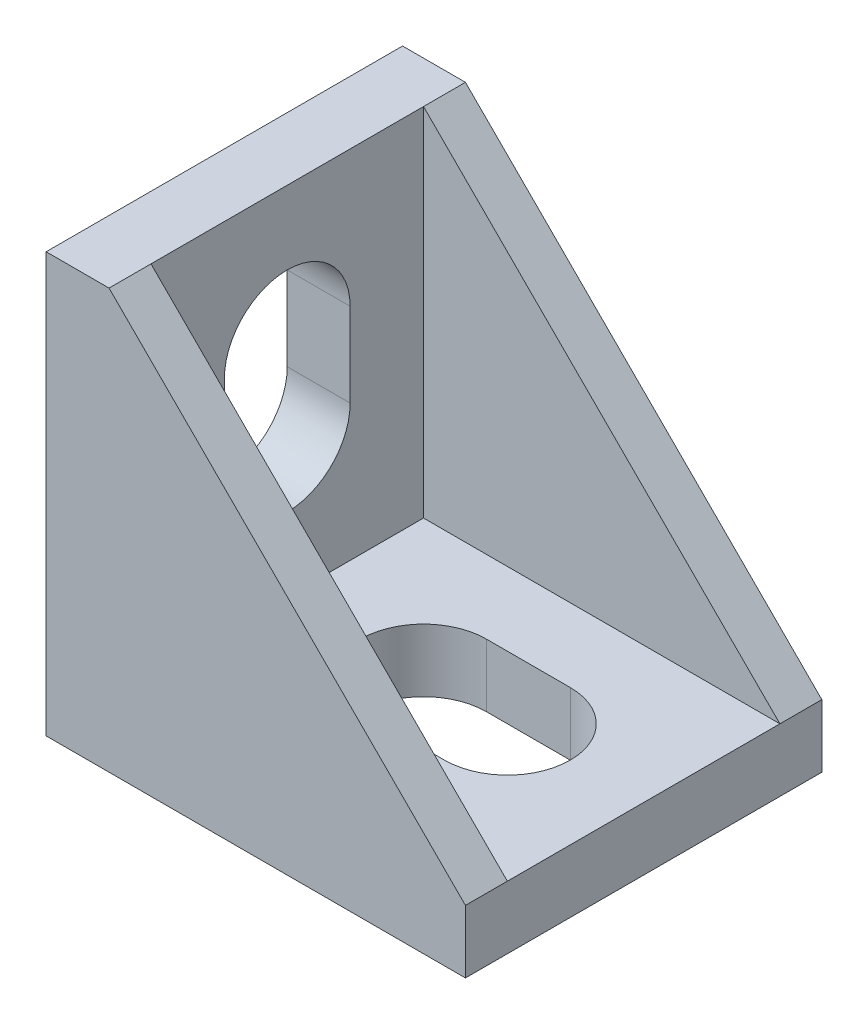
ISO-10303-21;
HEADER;
FILE_DESCRIPTION(('STEP AP214'),'2;1');
FILE_NAME('part.step','',(''),(''),'','','');
FILE_SCHEMA(('AUTOMOTIVE_DESIGN { 1 0 10303 214 1 1 1 1 }'));
ENDSEC;
DATA;
#1=APPLICATION_CONTEXT('core data for automotive mechanical design processes');
#2=APPLICATION_PROTOCOL_DEFINITION('international standard','automotive_design',2000,#1);
#3=PRODUCT_CONTEXT('',#1,'mechanical');
#4=PRODUCT('Part','Part','',(#3));
#5=PRODUCT_RELATED_PRODUCT_CATEGORY('part','',(#4));
#6=PRODUCT_DEFINITION_FORMATION('','',#4);
#7=PRODUCT_DEFINITION_CONTEXT('part definition',#1,'design');
#8=PRODUCT_DEFINITION('design','',#6,#7);
#9=PRODUCT_DEFINITION_SHAPE('','',#8);
#10=(LENGTH_UNIT() NAMED_UNIT(*) SI_UNIT(.MILLI.,.METRE.));
#11=(NAMED_UNIT(*) PLANE_ANGLE_UNIT() SI_UNIT($,.RADIAN.));
#12=(NAMED_UNIT(*) SI_UNIT($,.STERADIAN.) SOLID_ANGLE_UNIT());
#13=UNCERTAINTY_MEASURE_WITH_UNIT(LENGTH_MEASURE(1.E-05),#10,'distance_accuracy_value','');
#14=(GEOMETRIC_REPRESENTATION_CONTEXT(3) GLOBAL_UNCERTAINTY_ASSIGNED_CONTEXT((#13)) GLOBAL_UNIT_ASSIGNED_CONTEXT((#10,
#11,#12)) REPRESENTATION_CONTEXT('',''));
#15=CARTESIAN_POINT('',(0.,0.,0.));
#16=DIRECTION('',(0.,0.,1.));
#17=DIRECTION('',(1.,0.,0.));
#18=AXIS2_PLACEMENT_3D('',#15,#16,#17);
#19=CARTESIAN_POINT('',(0.,0.,17.));
#20=DIRECTION('',(1.,0.,0.));
#21=DIRECTION('',(0.,0.,-1.));
#22=AXIS2_PLACEMENT_3D('',#19,#20,#21);
#23=PLANE('',#22);
#24=DIRECTION('',(0.,-1.,0.));
#25=VECTOR('',#24,1.);
#26=CARTESIAN_POINT('',(0.,0.,0.));
#27=LINE('',#26,#25);
#28=CARTESIAN_POINT('',(0.,20.,0.));
#29=VERTEX_POINT('',#28);
#30=CARTESIAN_POINT('',(0.,0.,0.));
#31=VERTEX_POINT('',#30);
#32=EDGE_CURVE('E393',#29,#31,#27,.T.);
#33=ORIENTED_EDGE('',*,*,#32,.T.);
#34=DIRECTION('',(0.,0.,-1.));
#35=VECTOR('',#34,1.);
#36=CARTESIAN_POINT('',(0.,0.,17.));
#37=LINE('',#36,#35);
#38=CARTESIAN_POINT('',(0.,0.,17.));
#39=VERTEX_POINT('',#38);
#40=EDGE_CURVE('E400',#39,#31,#37,.T.);
#41=ORIENTED_EDGE('',*,*,#40,.F.);
#42=DIRECTION('',(0.,-1.,0.));
#43=VECTOR('',#42,1.);
#44=CARTESIAN_POINT('',(0.,0.,17.));
#45=LINE('',#44,#43);
#46=CARTESIAN_POINT('',(0.,20.,17.));
#47=VERTEX_POINT('',#46);
#48=EDGE_CURVE('E398',#47,#39,#45,.T.);
#49=ORIENTED_EDGE('',*,*,#48,.F.);
#50=DIRECTION('',(0.,0.,-1.));
#51=VECTOR('',#50,1.);
#52=CARTESIAN_POINT('',(0.,20.,17.));
#53=LINE('',#52,#51);
#54=EDGE_CURVE('E410',#47,#29,#53,.T.);
#55=ORIENTED_EDGE('',*,*,#54,.T.);
#56=EDGE_LOOP('',(#33,#41,#49,#55));
#57=FACE_BOUND('',#56,.T.);
#58=DIRECTION('',(0.,-1.,0.));
#59=VECTOR('',#58,1.);
#60=CARTESIAN_POINT('',(0.,13.5,5.50000000000001));
#61=LINE('',#60,#59);
#62=CARTESIAN_POINT('',(0.,13.5,5.50000000000001));
#63=VERTEX_POINT('',#62);
#64=CARTESIAN_POINT('',(0.,9.49999999999999,5.50000000000001));
#65=VERTEX_POINT('',#64);
#66=EDGE_CURVE('E308',#63,#65,#61,.T.);
#67=ORIENTED_EDGE('',*,*,#66,.F.);
#68=CARTESIAN_POINT('',(0.,13.5,8.5));
#69=DIRECTION('',(1.,0.,0.));
#70=DIRECTION('',(0.,0.,-1.));
#71=AXIS2_PLACEMENT_3D('',#68,#69,#70);
#72=CIRCLE('',#71,2.99999999999999);
#73=CARTESIAN_POINT('',(0.,13.5,11.5));
#74=VERTEX_POINT('',#73);
#75=EDGE_CURVE('E312',#63,#74,#72,.T.);
#76=ORIENTED_EDGE('',*,*,#75,.T.);
#77=DIRECTION('',(0.,-1.,0.));
#78=VECTOR('',#77,1.);
#79=CARTESIAN_POINT('',(0.,13.5,11.5));
#80=LINE('',#79,#78);
#81=CARTESIAN_POINT('',(0.,9.49999999999999,11.5));
#82=VERTEX_POINT('',#81);
#83=EDGE_CURVE('E640',#74,#82,#80,.T.);
#84=ORIENTED_EDGE('',*,*,#83,.T.);
#85=CARTESIAN_POINT('',(0.,9.49999999999999,8.5));
#86=DIRECTION('',(1.,0.,0.));
#87=DIRECTION('',(0.,0.,-1.));
#88=AXIS2_PLACEMENT_3D('',#85,#86,#87);
#89=CIRCLE('',#88,2.99999999999999);
#90=EDGE_CURVE('E207',#82,#65,#89,.T.);
#91=ORIENTED_EDGE('',*,*,#90,.T.);
#92=EDGE_LOOP('',(#67,#76,#84,#91));
#93=FACE_BOUND('',#92,.T.);
#94=ADVANCED_FACE('F184',(#57,#93),#23,.F.);
#95=CARTESIAN_POINT('',(3.,3.,17.));
#96=DIRECTION('',(0.,-1.,0.));
#97=DIRECTION('',(0.,0.,-1.));
#98=AXIS2_PLACEMENT_3D('',#95,#96,#97);
#99=PLANE('',#98);
#100=CARTESIAN_POINT('',(9.50000000000001,3.,8.5));
#101=DIRECTION('',(0.,1.,0.));
#102=DIRECTION('',(0.,0.,1.));
#103=AXIS2_PLACEMENT_3D('',#100,#101,#102);
#104=CIRCLE('',#103,3.);
#105=CARTESIAN_POINT('',(9.5,3.,5.5));
#106=VERTEX_POINT('',#105);
#107=CARTESIAN_POINT('',(9.5,3.,11.5));
#108=VERTEX_POINT('',#107);
#109=EDGE_CURVE('E341',#106,#108,#104,.T.);
#110=ORIENTED_EDGE('',*,*,#109,.F.);
#111=DIRECTION('',(1.,0.,0.));
#112=VECTOR('',#111,1.);
#113=CARTESIAN_POINT('',(9.5,3.,5.5));
#114=LINE('',#113,#112);
#115=CARTESIAN_POINT('',(13.5,3.,5.5));
#116=VERTEX_POINT('',#115);
#117=EDGE_CURVE('E338',#106,#116,#114,.T.);
#118=ORIENTED_EDGE('',*,*,#117,.T.);
#119=CARTESIAN_POINT('',(13.5,3.,8.5));
#120=DIRECTION('',(0.,1.,0.));
#121=DIRECTION('',(0.,0.,1.));
#122=AXIS2_PLACEMENT_3D('',#119,#120,#121);
#123=CIRCLE('',#122,3.);
#124=CARTESIAN_POINT('',(13.5,3.,11.5));
#125=VERTEX_POINT('',#124);
#126=EDGE_CURVE('E351',#125,#116,#123,.T.);
#127=ORIENTED_EDGE('',*,*,#126,.F.);
#128=DIRECTION('',(1.,0.,0.));
#129=VECTOR('',#128,1.);
#130=CARTESIAN_POINT('',(9.5,3.,11.5));
#131=LINE('',#130,#129);
#132=EDGE_CURVE('E331',#108,#125,#131,.T.);
#133=ORIENTED_EDGE('',*,*,#132,.F.);
#134=EDGE_LOOP('',(#110,#118,#127,#133));
#135=FACE_BOUND('',#134,.T.);
#136=DIRECTION('',(0.,0.,-1.));
#137=VECTOR('',#136,1.);
#138=CARTESIAN_POINT('',(20.,3.,17.));
#139=LINE('',#138,#137);
#140=CARTESIAN_POINT('',(20.,3.,15.));
#141=VERTEX_POINT('',#140);
#142=CARTESIAN_POINT('',(20.,3.,2.));
#143=VERTEX_POINT('',#142);
#144=EDGE_CURVE('E419',#141,#143,#139,.T.);
#145=ORIENTED_EDGE('',*,*,#144,.T.);
#146=DIRECTION('',(-1.,0.,0.));
#147=VECTOR('',#146,1.);
#148=CARTESIAN_POINT('',(20.,3.,2.));
#149=LINE('',#148,#147);
#150=CARTESIAN_POINT('',(3.,3.,2.));
#151=VERTEX_POINT('',#150);
#152=EDGE_CURVE('E367',#143,#151,#149,.T.);
#153=ORIENTED_EDGE('',*,*,#152,.T.);
#154=DIRECTION('',(0.,0.,-1.));
#155=VECTOR('',#154,1.);
#156=CARTESIAN_POINT('',(3.,3.,17.));
#157=LINE('',#156,#155);
#158=CARTESIAN_POINT('',(3.,3.,15.));
#159=VERTEX_POINT('',#158);
#160=EDGE_CURVE('E417',#159,#151,#157,.T.);
#161=ORIENTED_EDGE('',*,*,#160,.F.);
#162=DIRECTION('',(1.,0.,0.));
#163=VECTOR('',#162,1.);
#164=CARTESIAN_POINT('',(20.,3.,15.));
#165=LINE('',#164,#163);
#166=EDGE_CURVE('E380',#159,#141,#165,.T.);
#167=ORIENTED_EDGE('',*,*,#166,.T.);
#168=EDGE_LOOP('',(#145,#153,#161,#167));
#169=FACE_BOUND('',#168,.T.);
#170=ADVANCED_FACE('F426',(#135,#169),#99,.F.);
#171=CARTESIAN_POINT('',(3.,20.,17.));
#172=DIRECTION('',(-1.,0.,0.));
#173=DIRECTION('',(0.,-1.,0.));
#174=AXIS2_PLACEMENT_3D('',#171,#172,#173);
#175=PLANE('',#174);
#176=CARTESIAN_POINT('',(3.,13.5,8.5));
#177=DIRECTION('',(1.,0.,0.));
#178=DIRECTION('',(0.,0.,-1.));
#179=AXIS2_PLACEMENT_3D('',#176,#177,#178);
#180=CIRCLE('',#179,2.99999999999999);
#181=CARTESIAN_POINT('',(3.,13.5,5.50000000000001));
#182=VERTEX_POINT('',#181);
#183=CARTESIAN_POINT('',(3.,13.5,11.5));
#184=VERTEX_POINT('',#183);
#185=EDGE_CURVE('E199',#182,#184,#180,.T.);
#186=ORIENTED_EDGE('',*,*,#185,.F.);
#187=DIRECTION('',(0.,-1.,0.));
#188=VECTOR('',#187,1.);
#189=CARTESIAN_POINT('',(3.,13.5,5.50000000000001));
#190=LINE('',#189,#188);
#191=CARTESIAN_POINT('',(3.,9.49999999999999,5.50000000000001));
#192=VERTEX_POINT('',#191);
#193=EDGE_CURVE('E300',#182,#192,#190,.T.);
#194=ORIENTED_EDGE('',*,*,#193,.T.);
#195=CARTESIAN_POINT('',(3.,9.49999999999999,8.5));
#196=DIRECTION('',(1.,0.,0.));
#197=DIRECTION('',(0.,0.,-1.));
#198=AXIS2_PLACEMENT_3D('',#195,#196,#197);
#199=CIRCLE('',#198,2.99999999999999);
#200=CARTESIAN_POINT('',(3.,9.49999999999999,11.5));
#201=VERTEX_POINT('',#200);
#202=EDGE_CURVE('E314',#201,#192,#199,.T.);
#203=ORIENTED_EDGE('',*,*,#202,.F.);
#204=DIRECTION('',(0.,-1.,0.));
#205=VECTOR('',#204,1.);
#206=CARTESIAN_POINT('',(3.,13.5,11.5));
#207=LINE('',#206,#205);
#208=EDGE_CURVE('E320',#184,#201,#207,.T.);
#209=ORIENTED_EDGE('',*,*,#208,.F.);
#210=EDGE_LOOP('',(#186,#194,#203,#209));
#211=FACE_BOUND('',#210,.T.);
#212=ORIENTED_EDGE('',*,*,#160,.T.);
#213=DIRECTION('',(0.,1.,0.));
#214=VECTOR('',#213,1.);
#215=CARTESIAN_POINT('',(3.,3.,2.));
#216=LINE('',#215,#214);
#217=CARTESIAN_POINT('',(3.,20.,2.));
#218=VERTEX_POINT('',#217);
#219=EDGE_CURVE('E362',#151,#218,#216,.T.);
#220=ORIENTED_EDGE('',*,*,#219,.T.);
#221=DIRECTION('',(0.,0.,-1.));
#222=VECTOR('',#221,1.);
#223=CARTESIAN_POINT('',(3.,20.,17.));
#224=LINE('',#223,#222);
#225=CARTESIAN_POINT('',(3.,20.,15.));
#226=VERTEX_POINT('',#225);
#227=EDGE_CURVE('E413',#226,#218,#224,.T.);
#228=ORIENTED_EDGE('',*,*,#227,.F.);
#229=DIRECTION('',(0.,-1.,0.));
#230=VECTOR('',#229,1.);
#231=CARTESIAN_POINT('',(3.,3.,15.));
#232=LINE('',#231,#230);
#233=EDGE_CURVE('E377',#226,#159,#232,.T.);
#234=ORIENTED_EDGE('',*,*,#233,.T.);
#235=EDGE_LOOP('',(#212,#220,#228,#234));
#236=FACE_BOUND('',#235,.T.);
#237=ADVANCED_FACE('F318',(#211,#236),#175,.F.);
#238=CARTESIAN_POINT('',(20.,0.,17.));
#239=DIRECTION('',(0.,1.,0.));
#240=DIRECTION('',(-1.,0.,0.));
#241=AXIS2_PLACEMENT_3D('',#238,#239,#240);
#242=PLANE('',#241);
#243=DIRECTION('',(1.,0.,0.));
#244=VECTOR('',#243,1.);
#245=CARTESIAN_POINT('',(9.5,0.,11.5));
#246=LINE('',#245,#244);
#247=CARTESIAN_POINT('',(9.5,0.,11.5));
#248=VERTEX_POINT('',#247);
#249=CARTESIAN_POINT('',(13.5,0.,11.5));
#250=VERTEX_POINT('',#249);
#251=EDGE_CURVE('E333',#248,#250,#246,.T.);
#252=ORIENTED_EDGE('',*,*,#251,.T.);
#253=CARTESIAN_POINT('',(13.5,0.,8.5));
#254=DIRECTION('',(0.,1.,0.));
#255=DIRECTION('',(0.,0.,1.));
#256=AXIS2_PLACEMENT_3D('',#253,#254,#255);
#257=CIRCLE('',#256,3.);
#258=CARTESIAN_POINT('',(13.5,0.,5.5));
#259=VERTEX_POINT('',#258);
#260=EDGE_CURVE('E354',#250,#259,#257,.T.);
#261=ORIENTED_EDGE('',*,*,#260,.T.);
#262=DIRECTION('',(1.,0.,0.));
#263=VECTOR('',#262,1.);
#264=CARTESIAN_POINT('',(9.5,0.,5.5));
#265=LINE('',#264,#263);
#266=CARTESIAN_POINT('',(9.5,0.,5.5));
#267=VERTEX_POINT('',#266);
#268=EDGE_CURVE('E336',#267,#259,#265,.T.);
#269=ORIENTED_EDGE('',*,*,#268,.F.);
#270=CARTESIAN_POINT('',(9.50000000000001,0.,8.5));
#271=DIRECTION('',(0.,1.,0.));
#272=DIRECTION('',(0.,0.,1.));
#273=AXIS2_PLACEMENT_3D('',#270,#271,#272);
#274=CIRCLE('',#273,3.);
#275=EDGE_CURVE('E343',#267,#248,#274,.T.);
#276=ORIENTED_EDGE('',*,*,#275,.T.);
#277=EDGE_LOOP('',(#252,#261,#269,#276));
#278=FACE_BOUND('',#277,.T.);
#279=DIRECTION('',(1.,0.,0.));
#280=VECTOR('',#279,1.);
#281=CARTESIAN_POINT('',(20.,0.,0.));
#282=LINE('',#281,#280);
#283=CARTESIAN_POINT('',(20.,0.,0.));
#284=VERTEX_POINT('',#283);
#285=EDGE_CURVE('E386',#31,#284,#282,.T.);
#286=ORIENTED_EDGE('',*,*,#285,.T.);
#287=DIRECTION('',(0.,0.,-1.));
#288=VECTOR('',#287,1.);
#289=CARTESIAN_POINT('',(20.,0.,17.));
#290=LINE('',#289,#288);
#291=CARTESIAN_POINT('',(20.,0.,17.));
#292=VERTEX_POINT('',#291);
#293=EDGE_CURVE('E13',#292,#284,#290,.T.);
#294=ORIENTED_EDGE('',*,*,#293,.F.);
#295=DIRECTION('',(1.,0.,0.));
#296=VECTOR('',#295,1.);
#297=CARTESIAN_POINT('',(20.,0.,17.));
#298=LINE('',#297,#296);
#299=EDGE_CURVE('E389',#39,#292,#298,.T.);
#300=ORIENTED_EDGE('',*,*,#299,.F.);
#301=ORIENTED_EDGE('',*,*,#40,.T.);
#302=EDGE_LOOP('',(#286,#294,#300,#301));
#303=FACE_BOUND('',#302,.T.);
#304=ADVANCED_FACE('F186',(#278,#303),#242,.F.);
#305=CARTESIAN_POINT('',(20.,3.,17.));
#306=DIRECTION('',(-1.,0.,0.));
#307=DIRECTION('',(0.,0.,1.));
#308=AXIS2_PLACEMENT_3D('',#305,#306,#307);
#309=PLANE('',#308);
#310=DIRECTION('',(0.,1.,0.));
#311=VECTOR('',#310,1.);
#312=CARTESIAN_POINT('',(20.,3.,0.));
#313=LINE('',#312,#311);
#314=CARTESIAN_POINT('',(20.,3.,0.));
#315=VERTEX_POINT('',#314);
#316=EDGE_CURVE('E403',#284,#315,#313,.T.);
#317=ORIENTED_EDGE('',*,*,#316,.T.);
#318=DIRECTION('',(0.,0.,-1.));
#319=VECTOR('',#318,1.);
#320=CARTESIAN_POINT('',(20.,3.,2.));
#321=LINE('',#320,#319);
#322=EDGE_CURVE('E372',#143,#315,#321,.T.);
#323=ORIENTED_EDGE('',*,*,#322,.F.);
#324=ORIENTED_EDGE('',*,*,#144,.F.);
#325=CARTESIAN_POINT('',(20.,3.,17.));
#326=VERTEX_POINT('',#325);
#327=EDGE_CURVE('E192',#326,#141,#139,.T.);
#328=ORIENTED_EDGE('',*,*,#327,.F.);
#329=DIRECTION('',(0.,1.,0.));
#330=VECTOR('',#329,1.);
#331=CARTESIAN_POINT('',(20.,3.,17.));
#332=LINE('',#331,#330);
#333=EDGE_CURVE('E392',#292,#326,#332,.T.);
#334=ORIENTED_EDGE('',*,*,#333,.F.);
#335=ORIENTED_EDGE('',*,*,#293,.T.);
#336=EDGE_LOOP('',(#317,#323,#324,#328,#334,#335));
#337=FACE_BOUND('',#336,.T.);
#338=ADVANCED_FACE('F450',(#337),#309,.F.);
#339=CARTESIAN_POINT('',(0.,20.,17.));
#340=DIRECTION('',(0.,-1.,0.));
#341=DIRECTION('',(1.,0.,0.));
#342=AXIS2_PLACEMENT_3D('',#339,#340,#341);
#343=PLANE('',#342);
#344=DIRECTION('',(-1.,0.,0.));
#345=VECTOR('',#344,1.);
#346=CARTESIAN_POINT('',(0.,20.,0.));
#347=LINE('',#346,#345);
#348=CARTESIAN_POINT('',(3.,20.,0.));
#349=VERTEX_POINT('',#348);
#350=EDGE_CURVE('E405',#349,#29,#347,.T.);
#351=ORIENTED_EDGE('',*,*,#350,.T.);
#352=ORIENTED_EDGE('',*,*,#54,.F.);
#353=DIRECTION('',(-1.,0.,0.));
#354=VECTOR('',#353,1.);
#355=CARTESIAN_POINT('',(0.,20.,17.));
#356=LINE('',#355,#354);
#357=CARTESIAN_POINT('',(3.,20.,17.));
#358=VERTEX_POINT('',#357);
#359=EDGE_CURVE('E396',#358,#47,#356,.T.);
#360=ORIENTED_EDGE('',*,*,#359,.F.);
#361=EDGE_CURVE('E414',#358,#226,#224,.T.);
#362=ORIENTED_EDGE('',*,*,#361,.T.);
#363=ORIENTED_EDGE('',*,*,#227,.T.);
#364=DIRECTION('',(0.,0.,-1.));
#365=VECTOR('',#364,1.);
#366=CARTESIAN_POINT('',(3.,20.,2.));
#367=LINE('',#366,#365);
#368=EDGE_CURVE('E369',#218,#349,#367,.T.);
#369=ORIENTED_EDGE('',*,*,#368,.T.);
#370=EDGE_LOOP('',(#351,#352,#360,#362,#363,#369));
#371=FACE_BOUND('',#370,.T.);
#372=ADVANCED_FACE('F441',(#371),#343,.F.);
#373=CARTESIAN_POINT('',(0.,0.,17.));
#374=DIRECTION('',(0.,0.,-1.));
#375=DIRECTION('',(-1.,0.,0.));
#376=AXIS2_PLACEMENT_3D('',#373,#374,#375);
#377=PLANE('',#376);
#378=DIRECTION('',(-0.707106781186548,0.707106781186547,0.));
#379=VECTOR('',#378,1.);
#380=CARTESIAN_POINT('',(3.,20.,17.));
#381=LINE('',#380,#379);
#382=EDGE_CURVE('E375',#326,#358,#381,.T.);
#383=ORIENTED_EDGE('',*,*,#382,.T.);
#384=ORIENTED_EDGE('',*,*,#359,.T.);
#385=ORIENTED_EDGE('',*,*,#48,.T.);
#386=ORIENTED_EDGE('',*,*,#299,.T.);
#387=ORIENTED_EDGE('',*,*,#333,.T.);
#388=EDGE_LOOP('',(#383,#384,#385,#386,#387));
#389=FACE_BOUND('',#388,.T.);
#390=ADVANCED_FACE('F447',(#389),#377,.F.);
#391=CARTESIAN_POINT('',(0.,0.,0.));
#392=DIRECTION('',(0.,0.,-1.));
#393=DIRECTION('',(-1.,0.,0.));
#394=AXIS2_PLACEMENT_3D('',#391,#392,#393);
#395=PLANE('',#394);
#396=ORIENTED_EDGE('',*,*,#350,.F.);
#397=DIRECTION('',(0.707106781186548,-0.707106781186547,0.));
#398=VECTOR('',#397,1.);
#399=CARTESIAN_POINT('',(3.,20.,0.));
#400=LINE('',#399,#398);
#401=EDGE_CURVE('E361',#349,#315,#400,.T.);
#402=ORIENTED_EDGE('',*,*,#401,.T.);
#403=ORIENTED_EDGE('',*,*,#316,.F.);
#404=ORIENTED_EDGE('',*,*,#285,.F.);
#405=ORIENTED_EDGE('',*,*,#32,.F.);
#406=EDGE_LOOP('',(#396,#402,#403,#404,#405));
#407=FACE_BOUND('',#406,.T.);
#408=ADVANCED_FACE('F468',(#407),#395,.T.);
#409=CARTESIAN_POINT('',(3.,20.,15.));
#410=DIRECTION('',(0.707106781186547,0.707106781186548,0.));
#411=DIRECTION('',(-0.707106781186548,0.707106781186547,0.));
#412=AXIS2_PLACEMENT_3D('',#409,#410,#411);
#413=PLANE('',#412);
#414=ORIENTED_EDGE('',*,*,#382,.F.);
#415=ORIENTED_EDGE('',*,*,#327,.T.);
#416=DIRECTION('',(-0.707106781186548,0.707106781186547,0.));
#417=VECTOR('',#416,1.);
#418=CARTESIAN_POINT('',(3.,20.,15.));
#419=LINE('',#418,#417);
#420=EDGE_CURVE('E383',#141,#226,#419,.T.);
#421=ORIENTED_EDGE('',*,*,#420,.T.);
#422=ORIENTED_EDGE('',*,*,#361,.F.);
#423=EDGE_LOOP('',(#414,#415,#421,#422));
#424=FACE_BOUND('',#423,.T.);
#425=ADVANCED_FACE('F445',(#424),#413,.T.);
#426=CARTESIAN_POINT('',(0.,0.,15.));
#427=DIRECTION('',(0.,0.,1.));
#428=DIRECTION('',(1.,0.,0.));
#429=AXIS2_PLACEMENT_3D('',#426,#427,#428);
#430=PLANE('',#429);
#431=ORIENTED_EDGE('',*,*,#233,.F.);
#432=ORIENTED_EDGE('',*,*,#420,.F.);
#433=ORIENTED_EDGE('',*,*,#166,.F.);
#434=EDGE_LOOP('',(#431,#432,#433));
#435=FACE_BOUND('',#434,.T.);
#436=ADVANCED_FACE('F573',(#435),#430,.F.);
#437=CARTESIAN_POINT('',(3.,20.,2.));
#438=DIRECTION('',(0.707106781186547,0.707106781186548,0.));
#439=DIRECTION('',(-0.707106781186548,0.707106781186547,0.));
#440=AXIS2_PLACEMENT_3D('',#437,#438,#439);
#441=PLANE('',#440);
#442=ORIENTED_EDGE('',*,*,#401,.F.);
#443=ORIENTED_EDGE('',*,*,#368,.F.);
#444=DIRECTION('',(0.707106781186548,-0.707106781186547,0.));
#445=VECTOR('',#444,1.);
#446=CARTESIAN_POINT('',(3.,20.,2.));
#447=LINE('',#446,#445);
#448=EDGE_CURVE('E364',#218,#143,#447,.T.);
#449=ORIENTED_EDGE('',*,*,#448,.T.);
#450=ORIENTED_EDGE('',*,*,#322,.T.);
#451=EDGE_LOOP('',(#442,#443,#449,#450));
#452=FACE_BOUND('',#451,.T.);
#453=ADVANCED_FACE('F434',(#452),#441,.T.);
#454=CARTESIAN_POINT('',(0.,0.,2.));
#455=DIRECTION('',(0.,0.,1.));
#456=DIRECTION('',(1.,0.,0.));
#457=AXIS2_PLACEMENT_3D('',#454,#455,#456);
#458=PLANE('',#457);
#459=ORIENTED_EDGE('',*,*,#219,.F.);
#460=ORIENTED_EDGE('',*,*,#152,.F.);
#461=ORIENTED_EDGE('',*,*,#448,.F.);
#462=EDGE_LOOP('',(#459,#460,#461));
#463=FACE_BOUND('',#462,.T.);
#464=ADVANCED_FACE('F437',(#463),#458,.T.);
#465=CARTESIAN_POINT('',(13.5,3.,8.5));
#466=DIRECTION('',(0.,1.,0.));
#467=DIRECTION('',(0.,0.,1.));
#468=AXIS2_PLACEMENT_3D('',#465,#466,#467);
#469=CYLINDRICAL_SURFACE('',#468,3.);
#470=ORIENTED_EDGE('',*,*,#260,.F.);
#471=DIRECTION('',(0.,1.,0.));
#472=VECTOR('',#471,1.);
#473=CARTESIAN_POINT('',(13.5,3.,11.5));
#474=LINE('',#473,#472);
#475=EDGE_CURVE('E359',#125,#250,#474,.F.);
#476=ORIENTED_EDGE('',*,*,#475,.F.);
#477=ORIENTED_EDGE('',*,*,#126,.T.);
#478=DIRECTION('',(0.,1.,0.));
#479=VECTOR('',#478,1.);
#480=CARTESIAN_POINT('',(13.5,3.,5.5));
#481=LINE('',#480,#479);
#482=EDGE_CURVE('E357',#259,#116,#481,.T.);
#483=ORIENTED_EDGE('',*,*,#482,.F.);
#484=EDGE_LOOP('',(#470,#476,#477,#483));
#485=FACE_BOUND('',#484,.T.);
#486=ADVANCED_FACE('F490',(#485),#469,.F.);
#487=CARTESIAN_POINT('',(9.50000000000001,3.,8.5));
#488=DIRECTION('',(0.,1.,0.));
#489=DIRECTION('',(0.,0.,1.));
#490=AXIS2_PLACEMENT_3D('',#487,#488,#489);
#491=CYLINDRICAL_SURFACE('',#490,3.);
#492=ORIENTED_EDGE('',*,*,#109,.T.);
#493=DIRECTION('',(0.,1.,0.));
#494=VECTOR('',#493,1.);
#495=CARTESIAN_POINT('',(9.50000000000001,3.,11.5));
#496=LINE('',#495,#494);
#497=EDGE_CURVE('E346',#248,#108,#496,.T.);
#498=ORIENTED_EDGE('',*,*,#497,.F.);
#499=ORIENTED_EDGE('',*,*,#275,.F.);
#500=DIRECTION('',(0.,1.,0.));
#501=VECTOR('',#500,1.);
#502=CARTESIAN_POINT('',(9.50000000000001,3.,5.5));
#503=LINE('',#502,#501);
#504=EDGE_CURVE('E349',#106,#267,#503,.F.);
#505=ORIENTED_EDGE('',*,*,#504,.F.);
#506=EDGE_LOOP('',(#492,#498,#499,#505));
#507=FACE_BOUND('',#506,.T.);
#508=ADVANCED_FACE('F495',(#507),#491,.F.);
#509=CARTESIAN_POINT('',(9.5,3.,5.5));
#510=DIRECTION('',(0.,0.,-1.));
#511=DIRECTION('',(-1.,0.,0.));
#512=AXIS2_PLACEMENT_3D('',#509,#510,#511);
#513=PLANE('',#512);
#514=ORIENTED_EDGE('',*,*,#482,.T.);
#515=ORIENTED_EDGE('',*,*,#117,.F.);
#516=ORIENTED_EDGE('',*,*,#504,.T.);
#517=ORIENTED_EDGE('',*,*,#268,.T.);
#518=EDGE_LOOP('',(#514,#515,#516,#517));
#519=FACE_BOUND('',#518,.T.);
#520=ADVANCED_FACE('F507',(#519),#513,.F.);
#521=CARTESIAN_POINT('',(9.5,3.,11.5));
#522=DIRECTION('',(0.,0.,1.));
#523=DIRECTION('',(1.,0.,0.));
#524=AXIS2_PLACEMENT_3D('',#521,#522,#523);
#525=PLANE('',#524);
#526=ORIENTED_EDGE('',*,*,#475,.T.);
#527=ORIENTED_EDGE('',*,*,#251,.F.);
#528=ORIENTED_EDGE('',*,*,#497,.T.);
#529=ORIENTED_EDGE('',*,*,#132,.T.);
#530=EDGE_LOOP('',(#526,#527,#528,#529));
#531=FACE_BOUND('',#530,.T.);
#532=ADVANCED_FACE('F517',(#531),#525,.F.);
#533=CARTESIAN_POINT('',(3.,9.49999999999999,8.5));
#534=DIRECTION('',(1.,0.,0.));
#535=DIRECTION('',(0.,0.,-1.));
#536=AXIS2_PLACEMENT_3D('',#533,#534,#535);
#537=CYLINDRICAL_SURFACE('',#536,2.99999999999999);
#538=ORIENTED_EDGE('',*,*,#202,.T.);
#539=DIRECTION('',(1.,0.,0.));
#540=VECTOR('',#539,1.);
#541=CARTESIAN_POINT('',(3.,9.49999999999999,5.50000000000001));
#542=LINE('',#541,#540);
#543=EDGE_CURVE('E304',#65,#192,#542,.T.);
#544=ORIENTED_EDGE('',*,*,#543,.F.);
#545=ORIENTED_EDGE('',*,*,#90,.F.);
#546=DIRECTION('',(1.,0.,0.));
#547=VECTOR('',#546,1.);
#548=CARTESIAN_POINT('',(3.,9.49999999999999,11.5));
#549=LINE('',#548,#547);
#550=EDGE_CURVE('E329',#201,#82,#549,.F.);
#551=ORIENTED_EDGE('',*,*,#550,.F.);
#552=EDGE_LOOP('',(#538,#544,#545,#551));
#553=FACE_BOUND('',#552,.T.);
#554=ADVANCED_FACE('F526',(#553),#537,.F.);
#555=CARTESIAN_POINT('',(3.,13.5,8.5));
#556=DIRECTION('',(1.,0.,0.));
#557=DIRECTION('',(0.,0.,-1.));
#558=AXIS2_PLACEMENT_3D('',#555,#556,#557);
#559=CYLINDRICAL_SURFACE('',#558,2.99999999999999);
#560=ORIENTED_EDGE('',*,*,#185,.T.);
#561=DIRECTION('',(1.,0.,0.));
#562=VECTOR('',#561,1.);
#563=CARTESIAN_POINT('',(3.,13.5,11.5));
#564=LINE('',#563,#562);
#565=EDGE_CURVE('E315',#74,#184,#564,.T.);
#566=ORIENTED_EDGE('',*,*,#565,.F.);
#567=ORIENTED_EDGE('',*,*,#75,.F.);
#568=DIRECTION('',(1.,0.,0.));
#569=VECTOR('',#568,1.);
#570=CARTESIAN_POINT('',(3.,13.5,5.50000000000001));
#571=LINE('',#570,#569);
#572=EDGE_CURVE('E302',#182,#63,#571,.F.);
#573=ORIENTED_EDGE('',*,*,#572,.F.);
#574=EDGE_LOOP('',(#560,#566,#567,#573));
#575=FACE_BOUND('',#574,.T.);
#576=ADVANCED_FACE('F310',(#575),#559,.F.);
#577=CARTESIAN_POINT('',(3.,13.5,5.50000000000001));
#578=DIRECTION('',(0.,0.,-1.));
#579=DIRECTION('',(-1.,0.,0.));
#580=AXIS2_PLACEMENT_3D('',#577,#578,#579);
#581=PLANE('',#580);
#582=ORIENTED_EDGE('',*,*,#543,.T.);
#583=ORIENTED_EDGE('',*,*,#193,.F.);
#584=ORIENTED_EDGE('',*,*,#572,.T.);
#585=ORIENTED_EDGE('',*,*,#66,.T.);
#586=EDGE_LOOP('',(#582,#583,#584,#585));
#587=FACE_BOUND('',#586,.T.);
#588=ADVANCED_FACE('F301',(#587),#581,.F.);
#589=CARTESIAN_POINT('',(3.,13.5,11.5));
#590=DIRECTION('',(0.,0.,1.));
#591=DIRECTION('',(1.,0.,0.));
#592=AXIS2_PLACEMENT_3D('',#589,#590,#591);
#593=PLANE('',#592);
#594=ORIENTED_EDGE('',*,*,#550,.T.);
#595=ORIENTED_EDGE('',*,*,#83,.F.);
#596=ORIENTED_EDGE('',*,*,#565,.T.);
#597=ORIENTED_EDGE('',*,*,#208,.T.);
#598=EDGE_LOOP('',(#594,#595,#596,#597));
#599=FACE_BOUND('',#598,.T.);
#600=ADVANCED_FACE('F555',(#599),#593,.F.);
#601=CLOSED_SHELL('',(#94,#170,#237,#304,#338,#372,#390,#408,#425,#436,#453,#464,#486,#508,#520,
#532,#554,#576,#588,#600));
#602=MANIFOLD_SOLID_BREP('B2',#601);
#603=ADVANCED_BREP_SHAPE_REPRESENTATION('',(#18,#602),#14);
#604=SHAPE_DEFINITION_REPRESENTATION(#9,#603);
ENDSEC;
END-ISO-10303-21;
